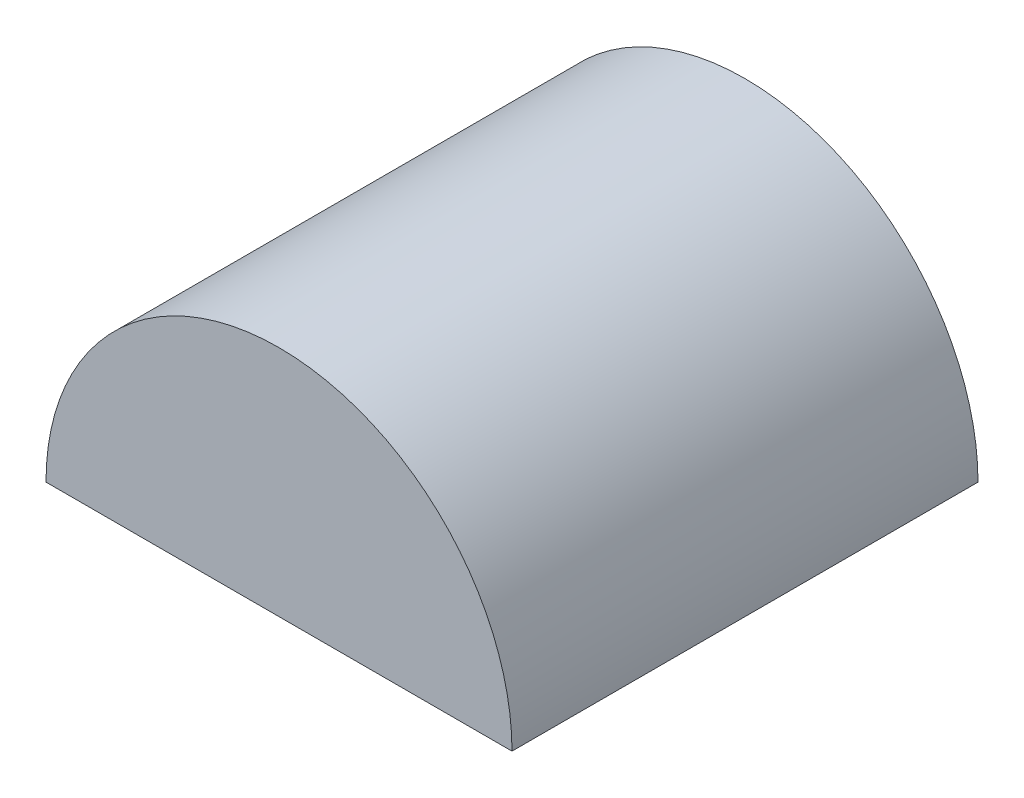
ISO-10303-21;
HEADER;
FILE_DESCRIPTION(('STEP AP214'),'2;1');
FILE_NAME('part.step','',(''),(''),'','','');
FILE_SCHEMA(('AUTOMOTIVE_DESIGN { 1 0 10303 214 1 1 1 1 }'));
ENDSEC;
DATA;
#1=APPLICATION_CONTEXT('core data for automotive mechanical design processes');
#2=APPLICATION_PROTOCOL_DEFINITION('international standard','automotive_design',2000,#1);
#3=PRODUCT_CONTEXT('',#1,'mechanical');
#4=PRODUCT('Part','Part','',(#3));
#5=PRODUCT_RELATED_PRODUCT_CATEGORY('part','',(#4));
#6=PRODUCT_DEFINITION_FORMATION('','',#4);
#7=PRODUCT_DEFINITION_CONTEXT('part definition',#1,'design');
#8=PRODUCT_DEFINITION('design','',#6,#7);
#9=PRODUCT_DEFINITION_SHAPE('','',#8);
#10=(LENGTH_UNIT() NAMED_UNIT(*) SI_UNIT(.MILLI.,.METRE.));
#11=(NAMED_UNIT(*) PLANE_ANGLE_UNIT() SI_UNIT($,.RADIAN.));
#12=(NAMED_UNIT(*) SI_UNIT($,.STERADIAN.) SOLID_ANGLE_UNIT());
#13=UNCERTAINTY_MEASURE_WITH_UNIT(LENGTH_MEASURE(1.E-05),#10,'distance_accuracy_value','');
#14=(GEOMETRIC_REPRESENTATION_CONTEXT(3) GLOBAL_UNCERTAINTY_ASSIGNED_CONTEXT((#13)) GLOBAL_UNIT_ASSIGNED_CONTEXT((#10,
#11,#12)) REPRESENTATION_CONTEXT('',''));
#15=CARTESIAN_POINT('',(0.,0.,0.));
#16=DIRECTION('',(0.,0.,1.));
#17=DIRECTION('',(1.,0.,0.));
#18=AXIS2_PLACEMENT_3D('',#15,#16,#17);
#19=CARTESIAN_POINT('',(0.,0.,0.5));
#20=DIRECTION('',(0.,0.,-1.));
#21=DIRECTION('',(-1.,0.,0.));
#22=AXIS2_PLACEMENT_3D('',#19,#20,#21);
#23=CYLINDRICAL_SURFACE('',#22,0.25);
#24=CARTESIAN_POINT('',(0.,0.,0.));
#25=DIRECTION('',(0.,0.,1.));
#26=DIRECTION('',(-1.,0.,0.));
#27=AXIS2_PLACEMENT_3D('',#24,#25,#26);
#28=CIRCLE('',#27,0.25);
#29=CARTESIAN_POINT('',(0.25,0.,0.));
#30=VERTEX_POINT('',#29);
#31=CARTESIAN_POINT('',(-0.25,0.,0.));
#32=VERTEX_POINT('',#31);
#33=EDGE_CURVE('E72',#30,#32,#28,.T.);
#34=ORIENTED_EDGE('',*,*,#33,.T.);
#35=DIRECTION('',(0.,0.,-1.));
#36=VECTOR('',#35,1.);
#37=CARTESIAN_POINT('',(-0.25,0.,0.5));
#38=LINE('',#37,#36);
#39=CARTESIAN_POINT('',(-0.25,0.,0.5));
#40=VERTEX_POINT('',#39);
#41=EDGE_CURVE('E48',#40,#32,#38,.T.);
#42=ORIENTED_EDGE('',*,*,#41,.F.);
#43=CARTESIAN_POINT('',(0.,0.,0.5));
#44=DIRECTION('',(0.,0.,1.));
#45=DIRECTION('',(-1.,0.,0.));
#46=AXIS2_PLACEMENT_3D('',#43,#44,#45);
#47=CIRCLE('',#46,0.25);
#48=CARTESIAN_POINT('',(0.25,0.,0.5));
#49=VERTEX_POINT('',#48);
#50=EDGE_CURVE('E78',#49,#40,#47,.T.);
#51=ORIENTED_EDGE('',*,*,#50,.F.);
#52=DIRECTION('',(0.,0.,-1.));
#53=VECTOR('',#52,1.);
#54=CARTESIAN_POINT('',(0.25,0.,0.5));
#55=LINE('',#54,#53);
#56=EDGE_CURVE('E11',#49,#30,#55,.T.);
#57=ORIENTED_EDGE('',*,*,#56,.T.);
#58=EDGE_LOOP('',(#34,#42,#51,#57));
#59=FACE_BOUND('',#58,.T.);
#60=ADVANCED_FACE('F39',(#59),#23,.T.);
#61=CARTESIAN_POINT('',(0.,0.,0.5));
#62=DIRECTION('',(0.,1.,0.));
#63=DIRECTION('',(0.,0.,1.));
#64=AXIS2_PLACEMENT_3D('',#61,#62,#63);
#65=PLANE('',#64);
#66=DIRECTION('',(1.,0.,0.));
#67=VECTOR('',#66,1.);
#68=CARTESIAN_POINT('',(0.,0.,0.));
#69=LINE('',#68,#67);
#70=EDGE_CURVE('E67',#32,#30,#69,.T.);
#71=ORIENTED_EDGE('',*,*,#70,.T.);
#72=ORIENTED_EDGE('',*,*,#56,.F.);
#73=DIRECTION('',(1.,0.,0.));
#74=VECTOR('',#73,1.);
#75=CARTESIAN_POINT('',(0.,0.,0.5));
#76=LINE('',#75,#74);
#77=EDGE_CURVE('E59',#40,#49,#76,.T.);
#78=ORIENTED_EDGE('',*,*,#77,.F.);
#79=ORIENTED_EDGE('',*,*,#41,.T.);
#80=EDGE_LOOP('',(#71,#72,#78,#79));
#81=FACE_BOUND('',#80,.T.);
#82=ADVANCED_FACE('F76',(#81),#65,.F.);
#83=CARTESIAN_POINT('',(0.,0.,0.5));
#84=DIRECTION('',(0.,0.,-1.));
#85=DIRECTION('',(-1.,0.,0.));
#86=AXIS2_PLACEMENT_3D('',#83,#84,#85);
#87=PLANE('',#86);
#88=ORIENTED_EDGE('',*,*,#77,.T.);
#89=ORIENTED_EDGE('',*,*,#50,.T.);
#90=EDGE_LOOP('',(#88,#89));
#91=FACE_BOUND('',#90,.T.);
#92=ADVANCED_FACE('F87',(#91),#87,.F.);
#93=CARTESIAN_POINT('',(0.,0.,0.));
#94=DIRECTION('',(0.,0.,-1.));
#95=DIRECTION('',(-1.,0.,0.));
#96=AXIS2_PLACEMENT_3D('',#93,#94,#95);
#97=PLANE('',#96);
#98=ORIENTED_EDGE('',*,*,#33,.F.);
#99=ORIENTED_EDGE('',*,*,#70,.F.);
#100=EDGE_LOOP('',(#98,#99));
#101=FACE_BOUND('',#100,.T.);
#102=ADVANCED_FACE('F79',(#101),#97,.T.);
#103=CLOSED_SHELL('',(#60,#82,#92,#102));
#104=MANIFOLD_SOLID_BREP('B2',#103);
#105=ADVANCED_BREP_SHAPE_REPRESENTATION('',(#18,#104),#14);
#106=SHAPE_DEFINITION_REPRESENTATION(#9,#105);
ENDSEC;
END-ISO-10303-21;
